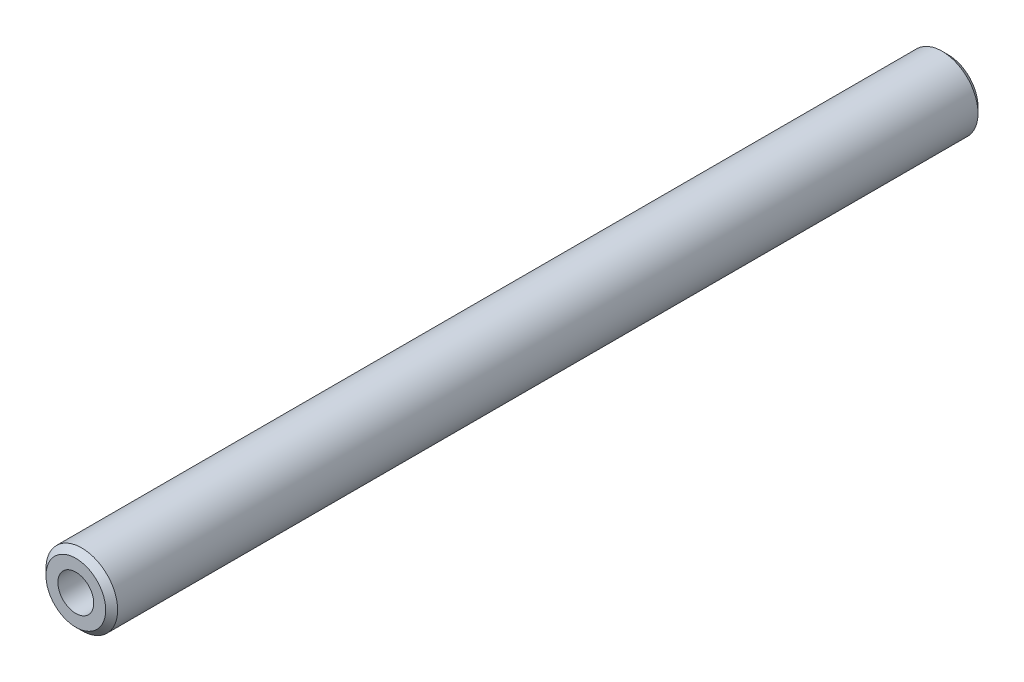
ISO-10303-21;
HEADER;
FILE_DESCRIPTION(('STEP AP214'),'2;1');
FILE_NAME('part.step','',(''),(''),'','','');
FILE_SCHEMA(('AUTOMOTIVE_DESIGN { 1 0 10303 214 1 1 1 1 }'));
ENDSEC;
DATA;
#1=APPLICATION_CONTEXT('core data for automotive mechanical design processes');
#2=APPLICATION_PROTOCOL_DEFINITION('international standard','automotive_design',2000,#1);
#3=PRODUCT_CONTEXT('',#1,'mechanical');
#4=PRODUCT('Part','Part','',(#3));
#5=PRODUCT_RELATED_PRODUCT_CATEGORY('part','',(#4));
#6=PRODUCT_DEFINITION_FORMATION('','',#4);
#7=PRODUCT_DEFINITION_CONTEXT('part definition',#1,'design');
#8=PRODUCT_DEFINITION('design','',#6,#7);
#9=PRODUCT_DEFINITION_SHAPE('','',#8);
#10=(LENGTH_UNIT() NAMED_UNIT(*) SI_UNIT(.MILLI.,.METRE.));
#11=(NAMED_UNIT(*) PLANE_ANGLE_UNIT() SI_UNIT($,.RADIAN.));
#12=(NAMED_UNIT(*) SI_UNIT($,.STERADIAN.) SOLID_ANGLE_UNIT());
#13=UNCERTAINTY_MEASURE_WITH_UNIT(LENGTH_MEASURE(1.E-05),#10,'distance_accuracy_value','');
#14=(GEOMETRIC_REPRESENTATION_CONTEXT(3) GLOBAL_UNCERTAINTY_ASSIGNED_CONTEXT((#13)) GLOBAL_UNIT_ASSIGNED_CONTEXT((#10,
#11,#12)) REPRESENTATION_CONTEXT('',''));
#15=CARTESIAN_POINT('',(0.,0.,0.));
#16=DIRECTION('',(0.,0.,1.));
#17=DIRECTION('',(1.,0.,0.));
#18=AXIS2_PLACEMENT_3D('',#15,#16,#17);
#19=CARTESIAN_POINT('',(0.,0.,146.));
#20=DIRECTION('',(0.,0.,1.));
#21=DIRECTION('',(1.,0.,0.));
#22=AXIS2_PLACEMENT_3D('',#19,#20,#21);
#23=PLANE('',#22);
#24=CARTESIAN_POINT('',(0.,0.,146.));
#25=DIRECTION('',(0.,0.,1.));
#26=DIRECTION('',(1.,0.,0.));
#27=AXIS2_PLACEMENT_3D('',#24,#25,#26);
#28=CIRCLE('',#27,5.00000000000003);
#29=CARTESIAN_POINT('',(5.00000000000003,0.,146.));
#30=VERTEX_POINT('',#29);
#31=EDGE_CURVE('E51',#30,#30,#28,.T.);
#32=ORIENTED_EDGE('',*,*,#31,.T.);
#33=EDGE_LOOP('',(#32));
#34=FACE_BOUND('',#33,.T.);
#35=CARTESIAN_POINT('',(0.,0.,146.));
#36=DIRECTION('',(0.,0.,1.));
#37=DIRECTION('',(1.,0.,0.));
#38=AXIS2_PLACEMENT_3D('',#35,#36,#37);
#39=CIRCLE('',#38,3.);
#40=CARTESIAN_POINT('',(3.,0.,146.));
#41=VERTEX_POINT('',#40);
#42=EDGE_CURVE('E56',#41,#41,#39,.T.);
#43=ORIENTED_EDGE('',*,*,#42,.F.);
#44=EDGE_LOOP('',(#43));
#45=FACE_BOUND('',#44,.T.);
#46=ADVANCED_FACE('F35',(#34,#45),#23,.T.);
#47=CARTESIAN_POINT('',(0.,0.,0.));
#48=DIRECTION('',(0.,0.,1.));
#49=DIRECTION('',(1.,0.,0.));
#50=AXIS2_PLACEMENT_3D('',#47,#48,#49);
#51=PLANE('',#50);
#52=CARTESIAN_POINT('',(0.,0.,0.));
#53=DIRECTION('',(0.,0.,1.));
#54=DIRECTION('',(1.,0.,0.));
#55=AXIS2_PLACEMENT_3D('',#52,#53,#54);
#56=CIRCLE('',#55,4.99999999999999);
#57=CARTESIAN_POINT('',(4.99999999999999,0.,0.));
#58=VERTEX_POINT('',#57);
#59=EDGE_CURVE('E10',#58,#58,#56,.F.);
#60=ORIENTED_EDGE('',*,*,#59,.T.);
#61=EDGE_LOOP('',(#60));
#62=FACE_BOUND('',#61,.T.);
#63=CARTESIAN_POINT('',(0.,0.,0.));
#64=DIRECTION('',(0.,0.,1.));
#65=DIRECTION('',(1.,0.,0.));
#66=AXIS2_PLACEMENT_3D('',#63,#64,#65);
#67=CIRCLE('',#66,3.);
#68=CARTESIAN_POINT('',(3.,0.,0.));
#69=VERTEX_POINT('',#68);
#70=EDGE_CURVE('E57',#69,#69,#67,.T.);
#71=ORIENTED_EDGE('',*,*,#70,.T.);
#72=EDGE_LOOP('',(#71));
#73=FACE_BOUND('',#72,.T.);
#74=ADVANCED_FACE('F67',(#62,#73),#51,.F.);
#75=CARTESIAN_POINT('',(0.,0.,146.));
#76=DIRECTION('',(0.,0.,-1.));
#77=DIRECTION('',(-1.,0.,0.));
#78=AXIS2_PLACEMENT_3D('',#75,#76,#77);
#79=CYLINDRICAL_SURFACE('',#78,6.);
#80=CARTESIAN_POINT('',(0.,0.,145.));
#81=DIRECTION('',(0.,0.,1.));
#82=DIRECTION('',(1.,0.,0.));
#83=AXIS2_PLACEMENT_3D('',#80,#81,#82);
#84=CIRCLE('',#83,6.);
#85=CARTESIAN_POINT('',(6.,0.,145.));
#86=VERTEX_POINT('',#85);
#87=EDGE_CURVE('E43',#86,#86,#84,.F.);
#88=ORIENTED_EDGE('',*,*,#87,.T.);
#89=EDGE_LOOP('',(#88));
#90=FACE_BOUND('',#89,.T.);
#91=CARTESIAN_POINT('',(0.,0.,1.));
#92=DIRECTION('',(0.,0.,1.));
#93=DIRECTION('',(1.,0.,0.));
#94=AXIS2_PLACEMENT_3D('',#91,#92,#93);
#95=CIRCLE('',#94,6.);
#96=CARTESIAN_POINT('',(6.,0.,1.));
#97=VERTEX_POINT('',#96);
#98=EDGE_CURVE('E47',#97,#97,#95,.T.);
#99=ORIENTED_EDGE('',*,*,#98,.T.);
#100=EDGE_LOOP('',(#99));
#101=FACE_BOUND('',#100,.T.);
#102=ADVANCED_FACE('F73',(#90,#101),#79,.T.);
#103=CARTESIAN_POINT('',(0.,0.,146.));
#104=DIRECTION('',(0.,0.,-1.));
#105=DIRECTION('',(-1.,0.,0.));
#106=AXIS2_PLACEMENT_3D('',#103,#104,#105);
#107=CYLINDRICAL_SURFACE('',#106,3.);
#108=ORIENTED_EDGE('',*,*,#42,.T.);
#109=EDGE_LOOP('',(#108));
#110=FACE_BOUND('',#109,.T.);
#111=ORIENTED_EDGE('',*,*,#70,.F.);
#112=EDGE_LOOP('',(#111));
#113=FACE_BOUND('',#112,.T.);
#114=ADVANCED_FACE('F63',(#110,#113),#107,.F.);
#115=CARTESIAN_POINT('',(0.,0.,146.));
#116=DIRECTION('',(0.,0.,-1.));
#117=DIRECTION('',(-1.,0.,0.));
#118=AXIS2_PLACEMENT_3D('',#115,#116,#117);
#119=CONICAL_SURFACE('',#118,5.00000000000003,0.785398163397432);
#120=ORIENTED_EDGE('',*,*,#87,.F.);
#121=EDGE_LOOP('',(#120));
#122=FACE_BOUND('',#121,.T.);
#123=ORIENTED_EDGE('',*,*,#31,.F.);
#124=EDGE_LOOP('',(#123));
#125=FACE_BOUND('',#124,.T.);
#126=ADVANCED_FACE('F79',(#122,#125),#119,.T.);
#127=CARTESIAN_POINT('',(0.,0.,1.));
#128=DIRECTION('',(0.,0.,1.));
#129=DIRECTION('',(1.,0.,0.));
#130=AXIS2_PLACEMENT_3D('',#127,#128,#129);
#131=CONICAL_SURFACE('',#130,6.,0.785398163397453);
#132=ORIENTED_EDGE('',*,*,#59,.F.);
#133=EDGE_LOOP('',(#132));
#134=FACE_BOUND('',#133,.T.);
#135=ORIENTED_EDGE('',*,*,#98,.F.);
#136=EDGE_LOOP('',(#135));
#137=FACE_BOUND('',#136,.T.);
#138=ADVANCED_FACE('F38',(#134,#137),#131,.T.);
#139=CLOSED_SHELL('',(#46,#74,#102,#114,#126,#138));
#140=MANIFOLD_SOLID_BREP('B2',#139);
#141=ADVANCED_BREP_SHAPE_REPRESENTATION('',(#18,#140),#14);
#142=SHAPE_DEFINITION_REPRESENTATION(#9,#141);
ENDSEC;
END-ISO-10303-21;
